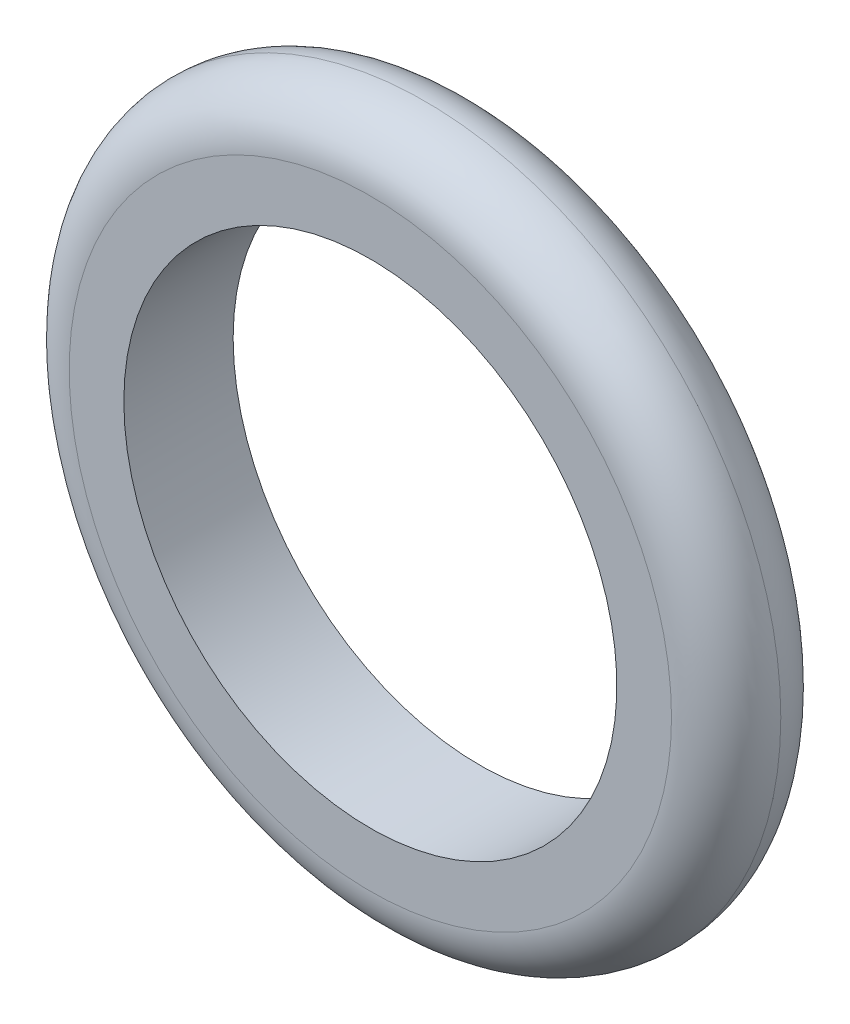
ISO-10303-21;
HEADER;
FILE_DESCRIPTION(('STEP AP214'),'2;1');
FILE_NAME('part.step','',(''),(''),'','','');
FILE_SCHEMA(('AUTOMOTIVE_DESIGN { 1 0 10303 214 1 1 1 1 }'));
ENDSEC;
DATA;
#1=APPLICATION_CONTEXT('core data for automotive mechanical design processes');
#2=APPLICATION_PROTOCOL_DEFINITION('international standard','automotive_design',2000,#1);
#3=PRODUCT_CONTEXT('',#1,'mechanical');
#4=PRODUCT('Part','Part','',(#3));
#5=PRODUCT_RELATED_PRODUCT_CATEGORY('part','',(#4));
#6=PRODUCT_DEFINITION_FORMATION('','',#4);
#7=PRODUCT_DEFINITION_CONTEXT('part definition',#1,'design');
#8=PRODUCT_DEFINITION('design','',#6,#7);
#9=PRODUCT_DEFINITION_SHAPE('','',#8);
#10=(LENGTH_UNIT() NAMED_UNIT(*) SI_UNIT(.MILLI.,.METRE.));
#11=(NAMED_UNIT(*) PLANE_ANGLE_UNIT() SI_UNIT($,.RADIAN.));
#12=(NAMED_UNIT(*) SI_UNIT($,.STERADIAN.) SOLID_ANGLE_UNIT());
#13=UNCERTAINTY_MEASURE_WITH_UNIT(LENGTH_MEASURE(1.E-05),#10,'distance_accuracy_value','');
#14=(GEOMETRIC_REPRESENTATION_CONTEXT(3) GLOBAL_UNCERTAINTY_ASSIGNED_CONTEXT((#13)) GLOBAL_UNIT_ASSIGNED_CONTEXT((#10,
#11,#12)) REPRESENTATION_CONTEXT('',''));
#15=CARTESIAN_POINT('',(0.,0.,0.));
#16=DIRECTION('',(0.,0.,1.));
#17=DIRECTION('',(1.,0.,0.));
#18=AXIS2_PLACEMENT_3D('',#15,#16,#17);
#19=CARTESIAN_POINT('',(0.,0.,90.));
#20=DIRECTION('',(0.,0.,1.));
#21=DIRECTION('',(1.,0.,0.));
#22=AXIS2_PLACEMENT_3D('',#19,#20,#21);
#23=PLANE('',#22);
#24=CARTESIAN_POINT('',(0.,0.,90.));
#25=DIRECTION('',(0.,0.,1.));
#26=DIRECTION('',(1.,0.,0.));
#27=AXIS2_PLACEMENT_3D('',#24,#25,#26);
#28=CIRCLE('',#27,248.);
#29=CARTESIAN_POINT('',(248.,0.,90.));
#30=VERTEX_POINT('',#29);
#31=EDGE_CURVE('E10',#30,#30,#28,.T.);
#32=ORIENTED_EDGE('',*,*,#31,.T.);
#33=EDGE_LOOP('',(#32));
#34=FACE_BOUND('',#33,.T.);
#35=CARTESIAN_POINT('',(0.,0.,90.));
#36=DIRECTION('',(0.,0.,1.));
#37=DIRECTION('',(1.,0.,0.));
#38=AXIS2_PLACEMENT_3D('',#35,#36,#37);
#39=CIRCLE('',#38,203.);
#40=CARTESIAN_POINT('',(-203.,0.,90.));
#41=VERTEX_POINT('',#40);
#42=EDGE_CURVE('E44',#41,#41,#39,.T.);
#43=ORIENTED_EDGE('',*,*,#42,.F.);
#44=EDGE_LOOP('',(#43));
#45=FACE_BOUND('',#44,.T.);
#46=ADVANCED_FACE('F32',(#34,#45),#23,.T.);
#47=CARTESIAN_POINT('',(0.,0.,0.));
#48=DIRECTION('',(0.,0.,1.));
#49=DIRECTION('',(1.,0.,0.));
#50=AXIS2_PLACEMENT_3D('',#47,#48,#49);
#51=PLANE('',#50);
#52=CARTESIAN_POINT('',(0.,0.,0.));
#53=DIRECTION('',(0.,0.,1.));
#54=DIRECTION('',(1.,0.,0.));
#55=AXIS2_PLACEMENT_3D('',#52,#53,#54);
#56=CIRCLE('',#55,248.);
#57=CARTESIAN_POINT('',(248.,0.,0.));
#58=VERTEX_POINT('',#57);
#59=EDGE_CURVE('E40',#58,#58,#56,.F.);
#60=ORIENTED_EDGE('',*,*,#59,.T.);
#61=EDGE_LOOP('',(#60));
#62=FACE_BOUND('',#61,.T.);
#63=CARTESIAN_POINT('',(0.,0.,0.));
#64=DIRECTION('',(0.,0.,1.));
#65=DIRECTION('',(1.,0.,0.));
#66=AXIS2_PLACEMENT_3D('',#63,#64,#65);
#67=CIRCLE('',#66,203.);
#68=CARTESIAN_POINT('',(-203.,0.,0.));
#69=VERTEX_POINT('',#68);
#70=EDGE_CURVE('E47',#69,#69,#67,.T.);
#71=ORIENTED_EDGE('',*,*,#70,.T.);
#72=EDGE_LOOP('',(#71));
#73=FACE_BOUND('',#72,.T.);
#74=ADVANCED_FACE('F57',(#62,#73),#51,.F.);
#75=CARTESIAN_POINT('',(0.,0.,90.));
#76=DIRECTION('',(0.,0.,-1.));
#77=DIRECTION('',(-1.,0.,0.));
#78=AXIS2_PLACEMENT_3D('',#75,#76,#77);
#79=CYLINDRICAL_SURFACE('',#78,203.);
#80=CARTESIAN_POINT('',(-203.,0.,90.));
#81=CARTESIAN_POINT('',(-203.,0.,89.0625));
#82=CARTESIAN_POINT('',(-203.,0.,88.125));
#83=CARTESIAN_POINT('',(-203.,0.,86.25));
#84=CARTESIAN_POINT('',(-203.,0.,85.3125));
#85=CARTESIAN_POINT('',(-203.,0.,83.4375));
#86=CARTESIAN_POINT('',(-203.,0.,82.5));
#87=CARTESIAN_POINT('',(-203.,0.,80.625));
#88=CARTESIAN_POINT('',(-203.,0.,79.6875));
#89=CARTESIAN_POINT('',(-203.,0.,77.8125));
#90=CARTESIAN_POINT('',(-203.,0.,76.875));
#91=CARTESIAN_POINT('',(-203.,0.,75.));
#92=CARTESIAN_POINT('',(-203.,0.,74.0625));
#93=CARTESIAN_POINT('',(-203.,0.,72.1875));
#94=CARTESIAN_POINT('',(-203.,0.,71.25));
#95=CARTESIAN_POINT('',(-203.,0.,69.375));
#96=CARTESIAN_POINT('',(-203.,0.,68.4375));
#97=CARTESIAN_POINT('',(-203.,0.,66.5625));
#98=CARTESIAN_POINT('',(-203.,0.,65.625));
#99=CARTESIAN_POINT('',(-203.,0.,63.75));
#100=CARTESIAN_POINT('',(-203.,0.,62.8125));
#101=CARTESIAN_POINT('',(-203.,0.,60.9375));
#102=CARTESIAN_POINT('',(-203.,0.,60.));
#103=CARTESIAN_POINT('',(-203.,0.,58.125));
#104=CARTESIAN_POINT('',(-203.,0.,57.1875));
#105=CARTESIAN_POINT('',(-203.,0.,55.3125));
#106=CARTESIAN_POINT('',(-203.,0.,54.375));
#107=CARTESIAN_POINT('',(-203.,0.,52.5));
#108=CARTESIAN_POINT('',(-203.,0.,51.5625));
#109=CARTESIAN_POINT('',(-203.,0.,49.6875));
#110=CARTESIAN_POINT('',(-203.,0.,48.75));
#111=CARTESIAN_POINT('',(-203.,0.,46.875));
#112=CARTESIAN_POINT('',(-203.,0.,45.9375));
#113=CARTESIAN_POINT('',(-203.,0.,44.0625));
#114=CARTESIAN_POINT('',(-203.,0.,43.125));
#115=CARTESIAN_POINT('',(-203.,0.,41.25));
#116=CARTESIAN_POINT('',(-203.,0.,40.3125));
#117=CARTESIAN_POINT('',(-203.,0.,38.4375));
#118=CARTESIAN_POINT('',(-203.,0.,37.5));
#119=CARTESIAN_POINT('',(-203.,0.,35.625));
#120=CARTESIAN_POINT('',(-203.,0.,34.6875));
#121=CARTESIAN_POINT('',(-203.,0.,32.8125));
#122=CARTESIAN_POINT('',(-203.,0.,31.875));
#123=CARTESIAN_POINT('',(-203.,0.,30.));
#124=CARTESIAN_POINT('',(-203.,0.,29.0625));
#125=CARTESIAN_POINT('',(-203.,0.,27.1875));
#126=CARTESIAN_POINT('',(-203.,0.,26.25));
#127=CARTESIAN_POINT('',(-203.,0.,24.375));
#128=CARTESIAN_POINT('',(-203.,0.,23.4375));
#129=CARTESIAN_POINT('',(-203.,0.,21.5625));
#130=CARTESIAN_POINT('',(-203.,0.,20.625));
#131=CARTESIAN_POINT('',(-203.,0.,18.75));
#132=CARTESIAN_POINT('',(-203.,0.,17.8125));
#133=CARTESIAN_POINT('',(-203.,0.,15.9375));
#134=CARTESIAN_POINT('',(-203.,0.,15.));
#135=CARTESIAN_POINT('',(-203.,0.,13.125));
#136=CARTESIAN_POINT('',(-203.,0.,12.1875));
#137=CARTESIAN_POINT('',(-203.,0.,10.3125));
#138=CARTESIAN_POINT('',(-203.,0.,9.37499999999999));
#139=CARTESIAN_POINT('',(-203.,0.,7.49999999999999));
#140=CARTESIAN_POINT('',(-203.,0.,6.56249999999999));
#141=CARTESIAN_POINT('',(-203.,0.,4.68749999999999));
#142=CARTESIAN_POINT('',(-203.,0.,3.74999999999998));
#143=CARTESIAN_POINT('',(-203.,0.,1.87499999999998));
#144=CARTESIAN_POINT('',(-203.,0.,0.937499999999986));
#145=CARTESIAN_POINT('',(-203.,0.,0.));
#146=B_SPLINE_CURVE_WITH_KNOTS('',3,(#80,#81,#82,#83,#84,#85,#86,#87,#88,#89,#90,#91,#92,#93,
#94,#95,#96,#97,#98,#99,#100,#101,#102,#103,#104,#105,#106,#107,#108,#109,#110,#111,#112,#113,
#114,#115,#116,#117,#118,#119,#120,#121,#122,#123,#124,#125,#126,#127,#128,#129,#130,#131,#132,
#133,#134,#135,#136,#137,#138,#139,#140,#141,#142,#143,#144,#145),.UNSPECIFIED.,.F.,.F.,(4,2,2,
2,2,2,2,2,2,2,2,2,2,2,2,2,2,2,2,2,2,2,2,2,2,2,2,2,2,2,2,2,4),(0.,2.81250000000001,
5.62500000000001,8.43750000000001,11.25,14.0625,16.875,19.6875,22.5,25.3125,28.125,30.9375,
33.75,36.5625,39.375,42.1875,45.,47.8125,50.625,53.4375,56.25,59.0625,61.875,64.6875,67.5,
70.3125,73.125,75.9375,78.75,81.5625,84.375,87.1875,90.),.UNSPECIFIED.);
#147=EDGE_CURVE('BSEAM53',#41,#69,#146,.T.);
#148=ORIENTED_EDGE('',*,*,#42,.T.);
#149=ORIENTED_EDGE('',*,*,#70,.F.);
#150=ORIENTED_EDGE('',*,*,#147,.T.);
#151=ORIENTED_EDGE('',*,*,#147,.F.);
#152=EDGE_LOOP('',(#148,#150,#149,#151));
#153=FACE_BOUND('',#152,.T.);
#154=ADVANCED_FACE('F53',(#153),#79,.F.);
#155=CARTESIAN_POINT('',(0.,0.,45.));
#156=DIRECTION('',(0.,0.,1.));
#157=DIRECTION('',(1.,0.,0.));
#158=AXIS2_PLACEMENT_3D('',#155,#156,#157);
#159=TOROIDAL_SURFACE('',#158,248.,45.);
#160=ORIENTED_EDGE('',*,*,#31,.F.);
#161=EDGE_LOOP('',(#160));
#162=FACE_BOUND('',#161,.T.);
#163=CARTESIAN_POINT('',(0.,0.,45.));
#164=DIRECTION('',(0.,0.,1.));
#165=DIRECTION('',(1.,0.,0.));
#166=AXIS2_PLACEMENT_3D('',#163,#164,#165);
#167=CIRCLE('',#166,293.);
#168=CARTESIAN_POINT('',(293.,0.,45.));
#169=VERTEX_POINT('',#168);
#170=EDGE_CURVE('E36',#169,#169,#167,.F.);
#171=ORIENTED_EDGE('',*,*,#170,.F.);
#172=EDGE_LOOP('',(#171));
#173=FACE_BOUND('',#172,.T.);
#174=ADVANCED_FACE('F34',(#162,#173),#159,.T.);
#175=CARTESIAN_POINT('',(0.,0.,45.));
#176=DIRECTION('',(0.,0.,1.));
#177=DIRECTION('',(1.,0.,0.));
#178=AXIS2_PLACEMENT_3D('',#175,#176,#177);
#179=TOROIDAL_SURFACE('',#178,248.,45.);
#180=ORIENTED_EDGE('',*,*,#59,.F.);
#181=EDGE_LOOP('',(#180));
#182=FACE_BOUND('',#181,.T.);
#183=ORIENTED_EDGE('',*,*,#170,.T.);
#184=EDGE_LOOP('',(#183));
#185=FACE_BOUND('',#184,.T.);
#186=ADVANCED_FACE('F65',(#182,#185),#179,.T.);
#187=CLOSED_SHELL('',(#46,#74,#154,#174,#186));
#188=MANIFOLD_SOLID_BREP('B2',#187);
#189=ADVANCED_BREP_SHAPE_REPRESENTATION('',(#18,#188),#14);
#190=SHAPE_DEFINITION_REPRESENTATION(#9,#189);
ENDSEC;
END-ISO-10303-21;
